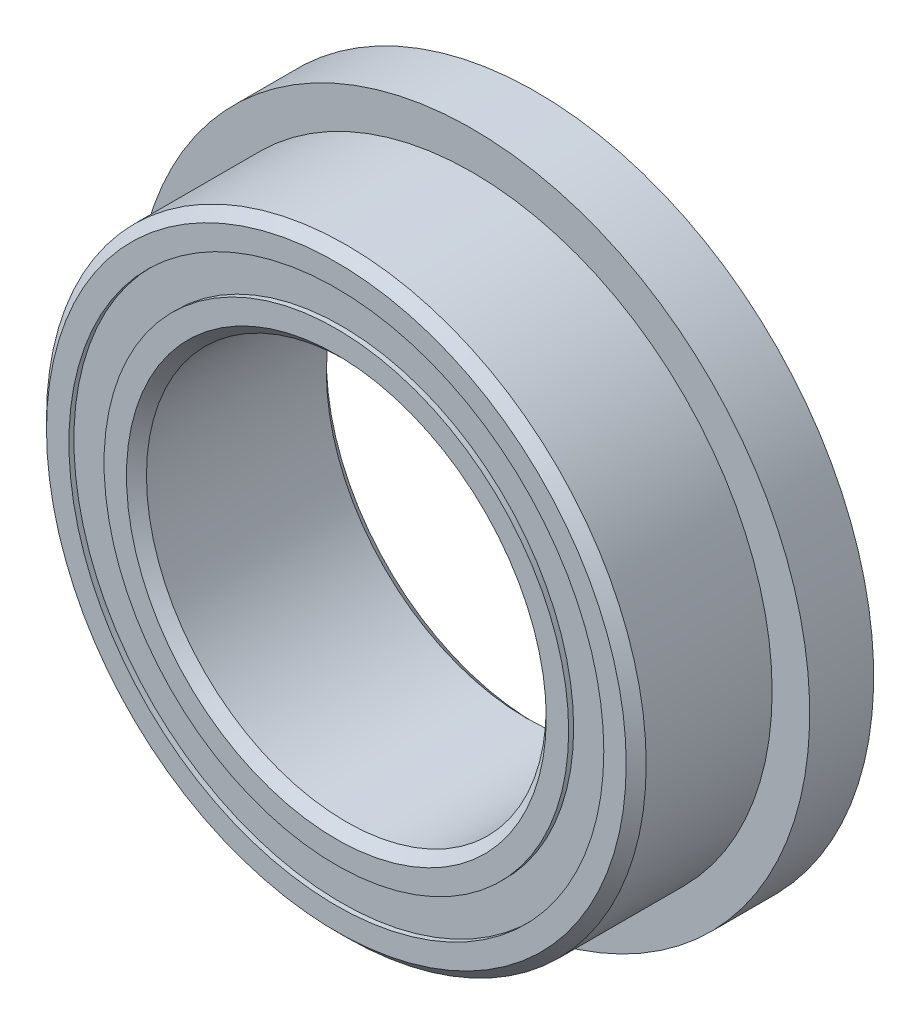
ISO-10303-21;
HEADER;
FILE_DESCRIPTION(('STEP AP214'),'2;1');
FILE_NAME('part.step','',(''),(''),'','','');
FILE_SCHEMA(('AUTOMOTIVE_DESIGN { 1 0 10303 214 1 1 1 1 }'));
ENDSEC;
DATA;
#1=APPLICATION_CONTEXT('core data for automotive mechanical design processes');
#2=APPLICATION_PROTOCOL_DEFINITION('international standard','automotive_design',2000,#1);
#3=PRODUCT_CONTEXT('',#1,'mechanical');
#4=PRODUCT('Part','Part','',(#3));
#5=PRODUCT_RELATED_PRODUCT_CATEGORY('part','',(#4));
#6=PRODUCT_DEFINITION_FORMATION('','',#4);
#7=PRODUCT_DEFINITION_CONTEXT('part definition',#1,'design');
#8=PRODUCT_DEFINITION('design','',#6,#7);
#9=PRODUCT_DEFINITION_SHAPE('','',#8);
#10=(LENGTH_UNIT() NAMED_UNIT(*) SI_UNIT(.MILLI.,.METRE.));
#11=(NAMED_UNIT(*) PLANE_ANGLE_UNIT() SI_UNIT($,.RADIAN.));
#12=(NAMED_UNIT(*) SI_UNIT($,.STERADIAN.) SOLID_ANGLE_UNIT());
#13=UNCERTAINTY_MEASURE_WITH_UNIT(LENGTH_MEASURE(1.E-05),#10,'distance_accuracy_value','');
#14=(GEOMETRIC_REPRESENTATION_CONTEXT(3) GLOBAL_UNCERTAINTY_ASSIGNED_CONTEXT((#13)) GLOBAL_UNIT_ASSIGNED_CONTEXT((#10,
#11,#12)) REPRESENTATION_CONTEXT('',''));
#15=CARTESIAN_POINT('',(0.,0.,0.));
#16=DIRECTION('',(0.,0.,1.));
#17=DIRECTION('',(1.,0.,0.));
#18=AXIS2_PLACEMENT_3D('',#15,#16,#17);
#19=CARTESIAN_POINT('',(0.,4.24787087912088,-1.508125));
#20=DIRECTION('',(0.,0.,1.));
#21=DIRECTION('',(1.,0.,0.));
#22=AXIS2_PLACEMENT_3D('',#19,#20,#21);
#23=PLANE('',#22);
#24=CARTESIAN_POINT('',(0.,0.,-1.508125));
#25=DIRECTION('',(0.,0.,1.));
#26=DIRECTION('',(1.,0.,0.));
#27=AXIS2_PLACEMENT_3D('',#24,#25,#26);
#28=CIRCLE('',#27,4.24787087912088);
#29=CARTESIAN_POINT('',(4.24787087912088,0.,-1.508125));
#30=VERTEX_POINT('',#29);
#31=EDGE_CURVE('E68',#30,#30,#28,.T.);
#32=ORIENTED_EDGE('',*,*,#31,.F.);
#33=EDGE_LOOP('',(#32));
#34=FACE_BOUND('',#33,.T.);
#35=CARTESIAN_POINT('',(0.,0.,-1.508125));
#36=DIRECTION('',(0.,0.,1.));
#37=DIRECTION('',(1.,0.,0.));
#38=AXIS2_PLACEMENT_3D('',#35,#36,#37);
#39=CIRCLE('',#38,3.68962912087912);
#40=CARTESIAN_POINT('',(3.68962912087912,0.,-1.508125));
#41=VERTEX_POINT('',#40);
#42=EDGE_CURVE('E11',#41,#41,#39,.T.);
#43=ORIENTED_EDGE('',*,*,#42,.T.);
#44=EDGE_LOOP('',(#43));
#45=FACE_BOUND('',#44,.T.);
#46=ADVANCED_FACE('F54',(#34,#45),#23,.F.);
#47=CARTESIAN_POINT('',(0.,0.,1.5875));
#48=DIRECTION('',(0.,0.,1.));
#49=DIRECTION('',(1.,0.,0.));
#50=AXIS2_PLACEMENT_3D('',#47,#48,#49);
#51=CYLINDRICAL_SURFACE('',#50,3.68962912087912);
#52=ORIENTED_EDGE('',*,*,#42,.F.);
#53=EDGE_LOOP('',(#52));
#54=FACE_BOUND('',#53,.T.);
#55=CARTESIAN_POINT('',(0.,0.,-0.758760243513405));
#56=DIRECTION('',(0.,0.,1.));
#57=DIRECTION('',(1.,0.,0.));
#58=AXIS2_PLACEMENT_3D('',#55,#56,#57);
#59=CIRCLE('',#58,3.68962912087912);
#60=CARTESIAN_POINT('',(3.68962912087912,0.,-0.758760243513405));
#61=VERTEX_POINT('',#60);
#62=EDGE_CURVE('E60',#61,#61,#59,.T.);
#63=ORIENTED_EDGE('',*,*,#62,.T.);
#64=EDGE_LOOP('',(#63));
#65=FACE_BOUND('',#64,.T.);
#66=ADVANCED_FACE('F77',(#54,#65),#51,.F.);
#67=CARTESIAN_POINT('',(0.,4.24787087912088,-0.758760243513405));
#68=DIRECTION('',(0.,0.,-1.));
#69=DIRECTION('',(-1.,0.,0.));
#70=AXIS2_PLACEMENT_3D('',#67,#68,#69);
#71=PLANE('',#70);
#72=ORIENTED_EDGE('',*,*,#62,.F.);
#73=EDGE_LOOP('',(#72));
#74=FACE_BOUND('',#73,.T.);
#75=CARTESIAN_POINT('',(0.,0.,-0.758760243513405));
#76=DIRECTION('',(0.,0.,1.));
#77=DIRECTION('',(1.,0.,0.));
#78=AXIS2_PLACEMENT_3D('',#75,#76,#77);
#79=CIRCLE('',#78,4.24787087912088);
#80=CARTESIAN_POINT('',(4.24787087912088,0.,-0.758760243513405));
#81=VERTEX_POINT('',#80);
#82=EDGE_CURVE('E64',#81,#81,#79,.T.);
#83=ORIENTED_EDGE('',*,*,#82,.T.);
#84=EDGE_LOOP('',(#83));
#85=FACE_BOUND('',#84,.T.);
#86=ADVANCED_FACE('F81',(#74,#85),#71,.F.);
#87=CARTESIAN_POINT('',(0.,0.,1.5875));
#88=DIRECTION('',(0.,0.,1.));
#89=DIRECTION('',(1.,0.,0.));
#90=AXIS2_PLACEMENT_3D('',#87,#88,#89);
#91=CYLINDRICAL_SURFACE('',#90,4.24787087912088);
#92=ORIENTED_EDGE('',*,*,#82,.F.);
#93=EDGE_LOOP('',(#92));
#94=FACE_BOUND('',#93,.T.);
#95=ORIENTED_EDGE('',*,*,#31,.T.);
#96=EDGE_LOOP('',(#95));
#97=FACE_BOUND('',#96,.T.);
#98=ADVANCED_FACE('F74',(#94,#97),#91,.T.);
#99=CLOSED_SHELL('',(#46,#66,#86,#98));
#100=MANIFOLD_SOLID_BREP('B2',#99);
#101=CARTESIAN_POINT('',(0.,4.24787087912088,1.508125));
#102=DIRECTION('',(0.,0.,-1.));
#103=DIRECTION('',(-1.,0.,0.));
#104=AXIS2_PLACEMENT_3D('',#101,#102,#103);
#105=PLANE('',#104);
#106=CARTESIAN_POINT('',(0.,0.,1.508125));
#107=DIRECTION('',(0.,0.,1.));
#108=DIRECTION('',(1.,0.,0.));
#109=AXIS2_PLACEMENT_3D('',#106,#107,#108);
#110=CIRCLE('',#109,3.68962912087912);
#111=CARTESIAN_POINT('',(3.68962912087912,0.,1.508125));
#112=VERTEX_POINT('',#111);
#113=EDGE_CURVE('E53',#112,#112,#110,.T.);
#114=ORIENTED_EDGE('',*,*,#113,.F.);
#115=EDGE_LOOP('',(#114));
#116=FACE_BOUND('',#115,.T.);
#117=CARTESIAN_POINT('',(0.,0.,1.508125));
#118=DIRECTION('',(0.,0.,1.));
#119=DIRECTION('',(1.,0.,0.));
#120=AXIS2_PLACEMENT_3D('',#117,#118,#119);
#121=CIRCLE('',#120,4.24787087912088);
#122=CARTESIAN_POINT('',(4.24787087912088,0.,1.508125));
#123=VERTEX_POINT('',#122);
#124=EDGE_CURVE('E136',#123,#123,#121,.T.);
#125=ORIENTED_EDGE('',*,*,#124,.T.);
#126=EDGE_LOOP('',(#125));
#127=FACE_BOUND('',#126,.T.);
#128=ADVANCED_FACE('F122',(#116,#127),#105,.F.);
#129=CARTESIAN_POINT('',(0.,0.,1.5875));
#130=DIRECTION('',(0.,0.,1.));
#131=DIRECTION('',(1.,0.,0.));
#132=AXIS2_PLACEMENT_3D('',#129,#130,#131);
#133=CYLINDRICAL_SURFACE('',#132,3.68962912087912);
#134=CARTESIAN_POINT('',(0.,0.,0.758760243513404));
#135=DIRECTION('',(0.,0.,1.));
#136=DIRECTION('',(1.,0.,0.));
#137=AXIS2_PLACEMENT_3D('',#134,#135,#136);
#138=CIRCLE('',#137,3.68962912087912);
#139=CARTESIAN_POINT('',(3.68962912087912,0.,0.758760243513404));
#140=VERTEX_POINT('',#139);
#141=EDGE_CURVE('E128',#140,#140,#138,.T.);
#142=ORIENTED_EDGE('',*,*,#141,.F.);
#143=EDGE_LOOP('',(#142));
#144=FACE_BOUND('',#143,.T.);
#145=ORIENTED_EDGE('',*,*,#113,.T.);
#146=EDGE_LOOP('',(#145));
#147=FACE_BOUND('',#146,.T.);
#148=ADVANCED_FACE('F151',(#144,#147),#133,.F.);
#149=CARTESIAN_POINT('',(0.,4.24787087912088,0.758760243513405));
#150=DIRECTION('',(0.,0.,1.));
#151=DIRECTION('',(1.,0.,0.));
#152=AXIS2_PLACEMENT_3D('',#149,#150,#151);
#153=PLANE('',#152);
#154=CARTESIAN_POINT('',(0.,0.,0.758760243513405));
#155=DIRECTION('',(0.,0.,1.));
#156=DIRECTION('',(1.,0.,0.));
#157=AXIS2_PLACEMENT_3D('',#154,#155,#156);
#158=CIRCLE('',#157,4.24787087912088);
#159=CARTESIAN_POINT('',(4.24787087912088,0.,0.758760243513405));
#160=VERTEX_POINT('',#159);
#161=EDGE_CURVE('E132',#160,#160,#158,.T.);
#162=ORIENTED_EDGE('',*,*,#161,.F.);
#163=EDGE_LOOP('',(#162));
#164=FACE_BOUND('',#163,.T.);
#165=ORIENTED_EDGE('',*,*,#141,.T.);
#166=EDGE_LOOP('',(#165));
#167=FACE_BOUND('',#166,.T.);
#168=ADVANCED_FACE('F146',(#164,#167),#153,.F.);
#169=CARTESIAN_POINT('',(0.,0.,1.5875));
#170=DIRECTION('',(0.,0.,1.));
#171=DIRECTION('',(1.,0.,0.));
#172=AXIS2_PLACEMENT_3D('',#169,#170,#171);
#173=CYLINDRICAL_SURFACE('',#172,4.24787087912088);
#174=ORIENTED_EDGE('',*,*,#124,.F.);
#175=EDGE_LOOP('',(#174));
#176=FACE_BOUND('',#175,.T.);
#177=ORIENTED_EDGE('',*,*,#161,.T.);
#178=EDGE_LOOP('',(#177));
#179=FACE_BOUND('',#178,.T.);
#180=ADVANCED_FACE('F143',(#176,#179),#173,.T.);
#181=CLOSED_SHELL('',(#128,#148,#168,#180));
#182=MANIFOLD_SOLID_BREP('B6',#181);
#183=CARTESIAN_POINT('',(-1.72197608962276,3.57572019448775,0.));
#184=DIRECTION('',(0.,0.,1.));
#185=DIRECTION('',(-0.433883739117546,0.900968867902425,0.));
#186=AXIS2_PLACEMENT_3D('',#183,#184,#185);
#187=SPHERICAL_SURFACE('',#186,0.758760243513405);
#188=CARTESIAN_POINT('',(-1.72197608962276,3.57572019448775,0.758760243513405));
#189=VERTEX_POINT('',#188);
#190=VERTEX_LOOP('',#189);
#191=FACE_BOUND('',#190,.T.);
#192=ADVANCED_FACE('F190',(#191),#187,.T.);
#193=CLOSED_SHELL('',(#192));
#194=MANIFOLD_SOLID_BREP('B48',#193);
#195=CARTESIAN_POINT('',(-3.10289369604496,2.47447515112689,0.));
#196=DIRECTION('',(0.,0.,1.));
#197=DIRECTION('',(-0.781831482468022,0.623489801858743,0.));
#198=AXIS2_PLACEMENT_3D('',#195,#196,#197);
#199=SPHERICAL_SURFACE('',#198,0.758760243513405);
#200=CARTESIAN_POINT('',(-3.10289369604496,2.47447515112689,0.758760243513405));
#201=VERTEX_POINT('',#200);
#202=VERTEX_LOOP('',#201);
#203=FACE_BOUND('',#202,.T.);
#204=ADVANCED_FACE('F215',(#203),#199,.T.);
#205=CLOSED_SHELL('',(#204));
#206=MANIFOLD_SOLID_BREP('B118',#205);
#207=CARTESIAN_POINT('',(-3.8692451514716,0.883129956639163,0.));
#208=DIRECTION('',(0.,0.,1.));
#209=DIRECTION('',(-0.974927912181821,0.222520933956325,0.));
#210=AXIS2_PLACEMENT_3D('',#207,#208,#209);
#211=SPHERICAL_SURFACE('',#210,0.758760243513405);
#212=CARTESIAN_POINT('',(-3.8692451514716,0.883129956639163,0.758760243513405));
#213=VERTEX_POINT('',#212);
#214=VERTEX_LOOP('',#213);
#215=FACE_BOUND('',#214,.T.);
#216=ADVANCED_FACE('F240',(#215),#211,.T.);
#217=CLOSED_SHELL('',(#216));
#218=MANIFOLD_SOLID_BREP('B186',#217);
#219=CARTESIAN_POINT('',(-3.86924515147162,-0.883129956639086,0.));
#220=DIRECTION('',(0.,0.,1.));
#221=DIRECTION('',(-0.974927912181826,-0.222520933956305,0.));
#222=AXIS2_PLACEMENT_3D('',#219,#220,#221);
#223=SPHERICAL_SURFACE('',#222,0.758760243513405);
#224=CARTESIAN_POINT('',(-3.86924515147162,-0.883129956639086,0.758760243513405));
#225=VERTEX_POINT('',#224);
#226=VERTEX_LOOP('',#225);
#227=FACE_BOUND('',#226,.T.);
#228=ADVANCED_FACE('F265',(#227),#223,.T.);
#229=CLOSED_SHELL('',(#228));
#230=MANIFOLD_SOLID_BREP('B211',#229);
#231=CARTESIAN_POINT('',(-3.10289369604501,-2.47447515112682,0.));
#232=DIRECTION('',(0.,0.,1.));
#233=DIRECTION('',(-0.781831482468035,-0.623489801858727,0.));
#234=AXIS2_PLACEMENT_3D('',#231,#232,#233);
#235=SPHERICAL_SURFACE('',#234,0.758760243513405);
#236=CARTESIAN_POINT('',(-3.10289369604501,-2.47447515112682,0.758760243513405));
#237=VERTEX_POINT('',#236);
#238=VERTEX_LOOP('',#237);
#239=FACE_BOUND('',#238,.T.);
#240=ADVANCED_FACE('F290',(#239),#235,.T.);
#241=CLOSED_SHELL('',(#240));
#242=MANIFOLD_SOLID_BREP('B236',#241);
#243=CARTESIAN_POINT('',(-1.72197608962284,-3.57572019448771,0.));
#244=DIRECTION('',(0.,0.,1.));
#245=DIRECTION('',(-0.433883739117565,-0.900968867902416,0.));
#246=AXIS2_PLACEMENT_3D('',#243,#244,#245);
#247=SPHERICAL_SURFACE('',#246,0.758760243513405);
#248=CARTESIAN_POINT('',(-1.72197608962284,-3.57572019448771,0.758760243513405));
#249=VERTEX_POINT('',#248);
#250=VERTEX_LOOP('',#249);
#251=FACE_BOUND('',#250,.T.);
#252=ADVANCED_FACE('F315',(#251),#247,.T.);
#253=CLOSED_SHELL('',(#252));
#254=MANIFOLD_SOLID_BREP('B261',#253);
#255=CARTESIAN_POINT('',(0.,-3.96875,0.));
#256=DIRECTION('',(0.,0.,1.));
#257=DIRECTION('',(0.,-1.,0.));
#258=AXIS2_PLACEMENT_3D('',#255,#256,#257);
#259=SPHERICAL_SURFACE('',#258,0.758760243513405);
#260=CARTESIAN_POINT('',(0.,-3.96875,0.758760243513405));
#261=VERTEX_POINT('',#260);
#262=VERTEX_LOOP('',#261);
#263=FACE_BOUND('',#262,.T.);
#264=ADVANCED_FACE('F340',(#263),#259,.T.);
#265=CLOSED_SHELL('',(#264));
#266=MANIFOLD_SOLID_BREP('B286',#265);
#267=CARTESIAN_POINT('',(1.72197608962279,-3.57572019448774,0.));
#268=DIRECTION('',(0.,0.,1.));
#269=DIRECTION('',(0.433883739117553,-0.900968867902422,0.));
#270=AXIS2_PLACEMENT_3D('',#267,#268,#269);
#271=SPHERICAL_SURFACE('',#270,0.758760243513405);
#272=CARTESIAN_POINT('',(1.72197608962279,-3.57572019448774,0.758760243513405));
#273=VERTEX_POINT('',#272);
#274=VERTEX_LOOP('',#273);
#275=FACE_BOUND('',#274,.T.);
#276=ADVANCED_FACE('F365',(#275),#271,.T.);
#277=CLOSED_SHELL('',(#276));
#278=MANIFOLD_SOLID_BREP('B311',#277);
#279=CARTESIAN_POINT('',(3.10289369604498,-2.47447515112686,0.));
#280=DIRECTION('',(0.,0.,1.));
#281=DIRECTION('',(0.781831482468027,-0.623489801858737,0.));
#282=AXIS2_PLACEMENT_3D('',#279,#280,#281);
#283=SPHERICAL_SURFACE('',#282,0.758760243513405);
#284=CARTESIAN_POINT('',(3.10289369604498,-2.47447515112686,0.758760243513405));
#285=VERTEX_POINT('',#284);
#286=VERTEX_LOOP('',#285);
#287=FACE_BOUND('',#286,.T.);
#288=ADVANCED_FACE('F390',(#287),#283,.T.);
#289=CLOSED_SHELL('',(#288));
#290=MANIFOLD_SOLID_BREP('B336',#289);
#291=CARTESIAN_POINT('',(3.86924515147161,-0.883129956639138,0.));
#292=DIRECTION('',(0.,0.,1.));
#293=DIRECTION('',(0.974927912181823,-0.222520933956318,0.));
#294=AXIS2_PLACEMENT_3D('',#291,#292,#293);
#295=SPHERICAL_SURFACE('',#294,0.758760243513405);
#296=CARTESIAN_POINT('',(3.86924515147161,-0.883129956639138,0.758760243513405));
#297=VERTEX_POINT('',#296);
#298=VERTEX_LOOP('',#297);
#299=FACE_BOUND('',#298,.T.);
#300=ADVANCED_FACE('F415',(#299),#295,.T.);
#301=CLOSED_SHELL('',(#300));
#302=MANIFOLD_SOLID_BREP('B361',#301);
#303=CARTESIAN_POINT('',(3.86924515147162,0.883129956639111,0.));
#304=DIRECTION('',(0.,0.,1.));
#305=DIRECTION('',(0.974927912181824,0.222520933956311,0.));
#306=AXIS2_PLACEMENT_3D('',#303,#304,#305);
#307=SPHERICAL_SURFACE('',#306,0.758760243513405);
#308=CARTESIAN_POINT('',(3.86924515147162,0.883129956639111,0.758760243513405));
#309=VERTEX_POINT('',#308);
#310=VERTEX_LOOP('',#309);
#311=FACE_BOUND('',#310,.T.);
#312=ADVANCED_FACE('F440',(#311),#307,.T.);
#313=CLOSED_SHELL('',(#312));
#314=MANIFOLD_SOLID_BREP('B386',#313);
#315=CARTESIAN_POINT('',(3.102893696045,2.47447515112684,0.));
#316=DIRECTION('',(0.,0.,1.));
#317=DIRECTION('',(0.781831482468031,0.623489801858732,0.));
#318=AXIS2_PLACEMENT_3D('',#315,#316,#317);
#319=SPHERICAL_SURFACE('',#318,0.758760243513405);
#320=CARTESIAN_POINT('',(3.102893696045,2.47447515112684,0.758760243513405));
#321=VERTEX_POINT('',#320);
#322=VERTEX_LOOP('',#321);
#323=FACE_BOUND('',#322,.T.);
#324=ADVANCED_FACE('F465',(#323),#319,.T.);
#325=CLOSED_SHELL('',(#324));
#326=MANIFOLD_SOLID_BREP('B411',#325);
#327=CARTESIAN_POINT('',(1.72197608962281,3.57572019448772,0.));
#328=DIRECTION('',(0.,0.,1.));
#329=DIRECTION('',(0.433883739117559,0.900968867902419,0.));
#330=AXIS2_PLACEMENT_3D('',#327,#328,#329);
#331=SPHERICAL_SURFACE('',#330,0.758760243513405);
#332=CARTESIAN_POINT('',(1.72197608962281,3.57572019448772,0.758760243513405));
#333=VERTEX_POINT('',#332);
#334=VERTEX_LOOP('',#333);
#335=FACE_BOUND('',#334,.T.);
#336=ADVANCED_FACE('F490',(#335),#331,.T.);
#337=CLOSED_SHELL('',(#336));
#338=MANIFOLD_SOLID_BREP('B436',#337);
#339=CARTESIAN_POINT('',(0.,3.96875,0.));
#340=DIRECTION('',(0.,0.,1.));
#341=DIRECTION('',(0.,1.,0.));
#342=AXIS2_PLACEMENT_3D('',#339,#340,#341);
#343=SPHERICAL_SURFACE('',#342,0.758760243513405);
#344=CARTESIAN_POINT('',(0.,3.96875,0.758760243513405));
#345=VERTEX_POINT('',#344);
#346=VERTEX_LOOP('',#345);
#347=FACE_BOUND('',#346,.T.);
#348=ADVANCED_FACE('F517',(#347),#343,.T.);
#349=CLOSED_SHELL('',(#348));
#350=MANIFOLD_SOLID_BREP('B461',#349);
#351=CARTESIAN_POINT('',(0.,3.68962912087912,1.5875));
#352=DIRECTION('',(0.,0.,-1.));
#353=DIRECTION('',(-1.,0.,0.));
#354=AXIS2_PLACEMENT_3D('',#351,#352,#353);
#355=PLANE('',#354);
#356=CARTESIAN_POINT('',(0.,0.,1.5875));
#357=DIRECTION('',(0.,0.,1.));
#358=DIRECTION('',(1.,0.,0.));
#359=AXIS2_PLACEMENT_3D('',#356,#357,#358);
#360=CIRCLE('',#359,3.33375);
#361=CARTESIAN_POINT('',(3.33375,0.,1.5875));
#362=VERTEX_POINT('',#361);
#363=EDGE_CURVE('E565',#362,#362,#360,.T.);
#364=ORIENTED_EDGE('',*,*,#363,.F.);
#365=EDGE_LOOP('',(#364));
#366=FACE_BOUND('',#365,.T.);
#367=CARTESIAN_POINT('',(0.,0.,1.5875));
#368=DIRECTION('',(0.,0.,1.));
#369=DIRECTION('',(1.,0.,0.));
#370=AXIS2_PLACEMENT_3D('',#367,#368,#369);
#371=CIRCLE('',#370,3.68962912087912);
#372=CARTESIAN_POINT('',(3.68962912087912,0.,1.5875));
#373=VERTEX_POINT('',#372);
#374=EDGE_CURVE('E516',#373,#373,#371,.T.);
#375=ORIENTED_EDGE('',*,*,#374,.T.);
#376=EDGE_LOOP('',(#375));
#377=FACE_BOUND('',#376,.T.);
#378=ADVANCED_FACE('F537',(#366,#377),#355,.F.);
#379=CARTESIAN_POINT('',(0.,0.,1.5875));
#380=DIRECTION('',(0.,0.,1.));
#381=DIRECTION('',(1.,0.,0.));
#382=AXIS2_PLACEMENT_3D('',#379,#380,#381);
#383=CYLINDRICAL_SURFACE('',#382,3.68962912087912);
#384=ORIENTED_EDGE('',*,*,#374,.F.);
#385=EDGE_LOOP('',(#384));
#386=FACE_BOUND('',#385,.T.);
#387=CARTESIAN_POINT('',(0.,0.,0.705555555555555));
#388=DIRECTION('',(0.,0.,1.));
#389=DIRECTION('',(1.,0.,0.));
#390=AXIS2_PLACEMENT_3D('',#387,#388,#389);
#391=CIRCLE('',#390,3.68962912087912);
#392=CARTESIAN_POINT('',(3.68962912087912,0.,0.705555555555555));
#393=VERTEX_POINT('',#392);
#394=EDGE_CURVE('E543',#393,#393,#391,.T.);
#395=ORIENTED_EDGE('',*,*,#394,.T.);
#396=EDGE_LOOP('',(#395));
#397=FACE_BOUND('',#396,.T.);
#398=ADVANCED_FACE('F572',(#386,#397),#383,.T.);
#399=CARTESIAN_POINT('',(0.,0.,0.));
#400=DIRECTION('',(0.,0.,1.));
#401=DIRECTION('',(1.,0.,0.));
#402=AXIS2_PLACEMENT_3D('',#399,#400,#401);
#403=TOROIDAL_SURFACE('',#402,3.96875,0.758760243513404);
#404=ORIENTED_EDGE('',*,*,#394,.F.);
#405=EDGE_LOOP('',(#404));
#406=FACE_BOUND('',#405,.T.);
#407=CARTESIAN_POINT('',(0.,0.,-0.705555555555556));
#408=DIRECTION('',(0.,0.,1.));
#409=DIRECTION('',(1.,0.,0.));
#410=AXIS2_PLACEMENT_3D('',#407,#408,#409);
#411=CIRCLE('',#410,3.68962912087912);
#412=CARTESIAN_POINT('',(3.68962912087912,0.,-0.705555555555556));
#413=VERTEX_POINT('',#412);
#414=EDGE_CURVE('E547',#413,#413,#411,.T.);
#415=ORIENTED_EDGE('',*,*,#414,.T.);
#416=EDGE_LOOP('',(#415));
#417=FACE_BOUND('',#416,.T.);
#418=ADVANCED_FACE('F576',(#406,#417),#403,.F.);
#419=CARTESIAN_POINT('',(0.,0.,1.5875));
#420=DIRECTION('',(0.,0.,1.));
#421=DIRECTION('',(1.,0.,0.));
#422=AXIS2_PLACEMENT_3D('',#419,#420,#421);
#423=CYLINDRICAL_SURFACE('',#422,3.68962912087912);
#424=ORIENTED_EDGE('',*,*,#414,.F.);
#425=EDGE_LOOP('',(#424));
#426=FACE_BOUND('',#425,.T.);
#427=CARTESIAN_POINT('',(0.,0.,-1.5875));
#428=DIRECTION('',(0.,0.,1.));
#429=DIRECTION('',(1.,0.,0.));
#430=AXIS2_PLACEMENT_3D('',#427,#428,#429);
#431=CIRCLE('',#430,3.68962912087912);
#432=CARTESIAN_POINT('',(3.68962912087912,0.,-1.5875));
#433=VERTEX_POINT('',#432);
#434=EDGE_CURVE('E551',#433,#433,#431,.T.);
#435=ORIENTED_EDGE('',*,*,#434,.T.);
#436=EDGE_LOOP('',(#435));
#437=FACE_BOUND('',#436,.T.);
#438=ADVANCED_FACE('F581',(#426,#437),#423,.T.);
#439=CARTESIAN_POINT('',(0.,3.33375,-1.5875));
#440=DIRECTION('',(0.,0.,1.));
#441=DIRECTION('',(1.,0.,0.));
#442=AXIS2_PLACEMENT_3D('',#439,#440,#441);
#443=PLANE('',#442);
#444=ORIENTED_EDGE('',*,*,#434,.F.);
#445=EDGE_LOOP('',(#444));
#446=FACE_BOUND('',#445,.T.);
#447=CARTESIAN_POINT('',(0.,0.,-1.5875));
#448=DIRECTION('',(0.,0.,1.));
#449=DIRECTION('',(1.,0.,0.));
#450=AXIS2_PLACEMENT_3D('',#447,#448,#449);
#451=CIRCLE('',#450,3.33375);
#452=CARTESIAN_POINT('',(3.33375,0.,-1.5875));
#453=VERTEX_POINT('',#452);
#454=EDGE_CURVE('E556',#453,#453,#451,.T.);
#455=ORIENTED_EDGE('',*,*,#454,.T.);
#456=EDGE_LOOP('',(#455));
#457=FACE_BOUND('',#456,.T.);
#458=ADVANCED_FACE('F587',(#446,#457),#443,.F.);
#459=CARTESIAN_POINT('',(0.,0.,-1.42875));
#460=DIRECTION('',(0.,0.,-1.));
#461=DIRECTION('',(-1.,0.,0.));
#462=AXIS2_PLACEMENT_3D('',#459,#460,#461);
#463=CONICAL_SURFACE('',#462,3.175,0.785398163397446);
#464=ORIENTED_EDGE('',*,*,#454,.F.);
#465=EDGE_LOOP('',(#464));
#466=FACE_BOUND('',#465,.T.);
#467=CARTESIAN_POINT('',(0.,0.,-1.42875));
#468=DIRECTION('',(0.,0.,1.));
#469=DIRECTION('',(1.,0.,0.));
#470=AXIS2_PLACEMENT_3D('',#467,#468,#469);
#471=CIRCLE('',#470,3.175);
#472=CARTESIAN_POINT('',(3.175,0.,-1.42875));
#473=VERTEX_POINT('',#472);
#474=EDGE_CURVE('E559',#473,#473,#471,.T.);
#475=ORIENTED_EDGE('',*,*,#474,.T.);
#476=EDGE_LOOP('',(#475));
#477=FACE_BOUND('',#476,.T.);
#478=ADVANCED_FACE('F591',(#466,#477),#463,.F.);
#479=CARTESIAN_POINT('',(0.,0.,1.5875));
#480=DIRECTION('',(0.,0.,1.));
#481=DIRECTION('',(1.,0.,0.));
#482=AXIS2_PLACEMENT_3D('',#479,#480,#481);
#483=CYLINDRICAL_SURFACE('',#482,3.175);
#484=ORIENTED_EDGE('',*,*,#474,.F.);
#485=EDGE_LOOP('',(#484));
#486=FACE_BOUND('',#485,.T.);
#487=CARTESIAN_POINT('',(0.,0.,1.42875));
#488=DIRECTION('',(0.,0.,1.));
#489=DIRECTION('',(1.,0.,0.));
#490=AXIS2_PLACEMENT_3D('',#487,#488,#489);
#491=CIRCLE('',#490,3.175);
#492=CARTESIAN_POINT('',(3.175,0.,1.42875));
#493=VERTEX_POINT('',#492);
#494=EDGE_CURVE('E562',#493,#493,#491,.T.);
#495=ORIENTED_EDGE('',*,*,#494,.T.);
#496=EDGE_LOOP('',(#495));
#497=FACE_BOUND('',#496,.T.);
#498=ADVANCED_FACE('F595',(#486,#497),#483,.F.);
#499=CARTESIAN_POINT('',(0.,0.,1.5875));
#500=DIRECTION('',(0.,0.,1.));
#501=DIRECTION('',(1.,0.,0.));
#502=AXIS2_PLACEMENT_3D('',#499,#500,#501);
#503=CONICAL_SURFACE('',#502,3.33375,0.785398163397451);
#504=ORIENTED_EDGE('',*,*,#494,.F.);
#505=EDGE_LOOP('',(#504));
#506=FACE_BOUND('',#505,.T.);
#507=ORIENTED_EDGE('',*,*,#363,.T.);
#508=EDGE_LOOP('',(#507));
#509=FACE_BOUND('',#508,.T.);
#510=ADVANCED_FACE('F569',(#506,#509),#503,.F.);
#511=CLOSED_SHELL('',(#378,#398,#418,#438,#458,#478,#498,#510));
#512=MANIFOLD_SOLID_BREP('B486',#511);
#513=CARTESIAN_POINT('',(0.,0.,1.42875));
#514=DIRECTION('',(0.,0.,-1.));
#515=DIRECTION('',(-1.,0.,0.));
#516=AXIS2_PLACEMENT_3D('',#513,#514,#515);
#517=CONICAL_SURFACE('',#516,4.7625,0.785398163397446);
#518=CARTESIAN_POINT('',(0.,0.,1.5875));
#519=DIRECTION('',(0.,0.,1.));
#520=DIRECTION('',(1.,0.,0.));
#521=AXIS2_PLACEMENT_3D('',#518,#519,#520);
#522=CIRCLE('',#521,4.60375);
#523=CARTESIAN_POINT('',(4.60375,0.,1.5875));
#524=VERTEX_POINT('',#523);
#525=EDGE_CURVE('E678',#524,#524,#522,.T.);
#526=ORIENTED_EDGE('',*,*,#525,.F.);
#527=EDGE_LOOP('',(#526));
#528=FACE_BOUND('',#527,.T.);
#529=CARTESIAN_POINT('',(0.,0.,1.42875));
#530=DIRECTION('',(0.,0.,1.));
#531=DIRECTION('',(1.,0.,0.));
#532=AXIS2_PLACEMENT_3D('',#529,#530,#531);
#533=CIRCLE('',#532,4.7625);
#534=CARTESIAN_POINT('',(4.7625,0.,1.42875));
#535=VERTEX_POINT('',#534);
#536=EDGE_CURVE('E536',#535,#535,#533,.T.);
#537=ORIENTED_EDGE('',*,*,#536,.T.);
#538=EDGE_LOOP('',(#537));
#539=FACE_BOUND('',#538,.T.);
#540=ADVANCED_FACE('F659',(#528,#539),#517,.T.);
#541=CARTESIAN_POINT('',(0.,0.,1.5875));
#542=DIRECTION('',(0.,0.,1.));
#543=DIRECTION('',(1.,0.,0.));
#544=AXIS2_PLACEMENT_3D('',#541,#542,#543);
#545=CYLINDRICAL_SURFACE('',#544,4.7625);
#546=CARTESIAN_POINT('',(0.,0.,-0.571499999999999));
#547=DIRECTION('',(0.,0.,1.));
#548=DIRECTION('',(1.,0.,0.));
#549=AXIS2_PLACEMENT_3D('',#546,#547,#548);
#550=CIRCLE('',#549,4.7625);
#551=CARTESIAN_POINT('',(4.7625,0.,-0.571499999999999));
#552=VERTEX_POINT('',#551);
#553=EDGE_CURVE('E681',#552,#552,#550,.T.);
#554=ORIENTED_EDGE('',*,*,#553,.T.);
#555=EDGE_LOOP('',(#554));
#556=FACE_BOUND('',#555,.T.);
#557=ORIENTED_EDGE('',*,*,#536,.F.);
#558=EDGE_LOOP('',(#557));
#559=FACE_BOUND('',#558,.T.);
#560=ADVANCED_FACE('F715',(#556,#559),#545,.T.);
#561=CARTESIAN_POINT('',(0.,0.,0.));
#562=DIRECTION('',(0.,0.,1.));
#563=DIRECTION('',(1.,0.,0.));
#564=AXIS2_PLACEMENT_3D('',#561,#562,#563);
#565=TOROIDAL_SURFACE('',#564,3.96875,0.758760243513405);
#566=CARTESIAN_POINT('',(0.,0.,-0.571499999999999));
#567=DIRECTION('',(0.,0.,1.));
#568=DIRECTION('',(1.,0.,0.));
#569=AXIS2_PLACEMENT_3D('',#566,#567,#568);
#570=CIRCLE('',#569,4.46785405441804);
#571=CARTESIAN_POINT('',(4.46785405441804,0.,-0.571499999999999));
#572=VERTEX_POINT('',#571);
#573=EDGE_CURVE('E662',#572,#572,#570,.F.);
#574=ORIENTED_EDGE('',*,*,#573,.T.);
#575=EDGE_LOOP('',(#574));
#576=FACE_BOUND('',#575,.T.);
#577=CARTESIAN_POINT('',(0.,0.,0.705555555555555));
#578=DIRECTION('',(0.,0.,1.));
#579=DIRECTION('',(1.,0.,0.));
#580=AXIS2_PLACEMENT_3D('',#577,#578,#579);
#581=CIRCLE('',#580,4.24787087912088);
#582=CARTESIAN_POINT('',(4.24787087912088,0.,0.705555555555555));
#583=VERTEX_POINT('',#582);
#584=EDGE_CURVE('E670',#583,#583,#581,.T.);
#585=ORIENTED_EDGE('',*,*,#584,.T.);
#586=EDGE_LOOP('',(#585));
#587=FACE_BOUND('',#586,.T.);
#588=ADVANCED_FACE('F721',(#576,#587),#565,.F.);
#589=CARTESIAN_POINT('',(0.,0.,1.5875));
#590=DIRECTION('',(0.,0.,1.));
#591=DIRECTION('',(1.,0.,0.));
#592=AXIS2_PLACEMENT_3D('',#589,#590,#591);
#593=CYLINDRICAL_SURFACE('',#592,4.24787087912088);
#594=ORIENTED_EDGE('',*,*,#584,.F.);
#595=EDGE_LOOP('',(#594));
#596=FACE_BOUND('',#595,.T.);
#597=CARTESIAN_POINT('',(0.,0.,1.5875));
#598=DIRECTION('',(0.,0.,1.));
#599=DIRECTION('',(1.,0.,0.));
#600=AXIS2_PLACEMENT_3D('',#597,#598,#599);
#601=CIRCLE('',#600,4.24787087912088);
#602=CARTESIAN_POINT('',(4.24787087912088,0.,1.5875));
#603=VERTEX_POINT('',#602);
#604=EDGE_CURVE('E675',#603,#603,#601,.T.);
#605=ORIENTED_EDGE('',*,*,#604,.T.);
#606=EDGE_LOOP('',(#605));
#607=FACE_BOUND('',#606,.T.);
#608=ADVANCED_FACE('F727',(#596,#607),#593,.F.);
#609=CARTESIAN_POINT('',(0.,4.60375,1.5875));
#610=DIRECTION('',(0.,0.,-1.));
#611=DIRECTION('',(-1.,0.,0.));
#612=AXIS2_PLACEMENT_3D('',#609,#610,#611);
#613=PLANE('',#612);
#614=ORIENTED_EDGE('',*,*,#604,.F.);
#615=EDGE_LOOP('',(#614));
#616=FACE_BOUND('',#615,.T.);
#617=ORIENTED_EDGE('',*,*,#525,.T.);
#618=EDGE_LOOP('',(#617));
#619=FACE_BOUND('',#618,.T.);
#620=ADVANCED_FACE('F725',(#616,#619),#613,.F.);
#621=CARTESIAN_POINT('',(0.,4.24787087912088,-0.571499999999999));
#622=DIRECTION('',(0.,0.,1.));
#623=DIRECTION('',(1.,0.,0.));
#624=AXIS2_PLACEMENT_3D('',#621,#622,#623);
#625=PLANE('',#624);
#626=CARTESIAN_POINT('',(0.,0.,-0.571499999999999));
#627=DIRECTION('',(0.,0.,-1.));
#628=DIRECTION('',(-1.,0.,0.));
#629=AXIS2_PLACEMENT_3D('',#626,#627,#628);
#630=CIRCLE('',#629,4.24787087912088);
#631=CARTESIAN_POINT('',(-4.24787087912088,0.,-0.571499999999999));
#632=VERTEX_POINT('',#631);
#633=EDGE_CURVE('E690',#632,#632,#630,.T.);
#634=ORIENTED_EDGE('',*,*,#633,.T.);
#635=EDGE_LOOP('',(#634));
#636=FACE_BOUND('',#635,.T.);
#637=ORIENTED_EDGE('',*,*,#573,.F.);
#638=EDGE_LOOP('',(#637));
#639=FACE_BOUND('',#638,.T.);
#640=ADVANCED_FACE('F694',(#636,#639),#625,.T.);
#641=CARTESIAN_POINT('',(0.,0.,-0.571499999999999));
#642=DIRECTION('',(0.,0.,-1.));
#643=DIRECTION('',(-1.,0.,0.));
#644=AXIS2_PLACEMENT_3D('',#641,#642,#643);
#645=CIRCLE('',#644,5.3594);
#646=CARTESIAN_POINT('',(-5.3594,0.,-0.571499999999999));
#647=VERTEX_POINT('',#646);
#648=EDGE_CURVE('E687',#647,#647,#645,.T.);
#649=ORIENTED_EDGE('',*,*,#648,.F.);
#650=EDGE_LOOP('',(#649));
#651=FACE_BOUND('',#650,.T.);
#652=ORIENTED_EDGE('',*,*,#553,.F.);
#653=EDGE_LOOP('',(#652));
#654=FACE_BOUND('',#653,.T.);
#655=ADVANCED_FACE('F709',(#651,#654),#625,.T.);
#656=CARTESIAN_POINT('',(0.,0.,-1.5875));
#657=DIRECTION('',(0.,0.,-1.));
#658=DIRECTION('',(-1.,0.,0.));
#659=AXIS2_PLACEMENT_3D('',#656,#657,#658);
#660=CYLINDRICAL_SURFACE('',#659,5.3594);
#661=ORIENTED_EDGE('',*,*,#648,.T.);
#662=EDGE_LOOP('',(#661));
#663=FACE_BOUND('',#662,.T.);
#664=CARTESIAN_POINT('',(0.,0.,-1.5875));
#665=DIRECTION('',(0.,0.,-1.));
#666=DIRECTION('',(-1.,0.,0.));
#667=AXIS2_PLACEMENT_3D('',#664,#665,#666);
#668=CIRCLE('',#667,5.3594);
#669=CARTESIAN_POINT('',(-5.3594,0.,-1.5875));
#670=VERTEX_POINT('',#669);
#671=EDGE_CURVE('E684',#670,#670,#668,.T.);
#672=ORIENTED_EDGE('',*,*,#671,.F.);
#673=EDGE_LOOP('',(#672));
#674=FACE_BOUND('',#673,.T.);
#675=ADVANCED_FACE('F700',(#663,#674),#660,.T.);
#676=CARTESIAN_POINT('',(0.,0.,1.5875));
#677=DIRECTION('',(0.,0.,1.));
#678=DIRECTION('',(1.,0.,0.));
#679=AXIS2_PLACEMENT_3D('',#676,#677,#678);
#680=CYLINDRICAL_SURFACE('',#679,4.24787087912088);
#681=CARTESIAN_POINT('',(0.,0.,-1.5875));
#682=DIRECTION('',(0.,0.,1.));
#683=DIRECTION('',(1.,0.,0.));
#684=AXIS2_PLACEMENT_3D('',#681,#682,#683);
#685=CIRCLE('',#684,4.24787087912088);
#686=CARTESIAN_POINT('',(4.24787087912088,0.,-1.5875));
#687=VERTEX_POINT('',#686);
#688=EDGE_CURVE('E666',#687,#687,#685,.T.);
#689=ORIENTED_EDGE('',*,*,#688,.F.);
#690=EDGE_LOOP('',(#689));
#691=FACE_BOUND('',#690,.T.);
#692=ORIENTED_EDGE('',*,*,#633,.F.);
#693=EDGE_LOOP('',(#692));
#694=FACE_BOUND('',#693,.T.);
#695=ADVANCED_FACE('F697',(#691,#694),#680,.F.);
#696=CARTESIAN_POINT('',(0.,4.60375,-1.5875));
#697=DIRECTION('',(0.,0.,1.));
#698=DIRECTION('',(1.,0.,0.));
#699=AXIS2_PLACEMENT_3D('',#696,#697,#698);
#700=PLANE('',#699);
#701=ORIENTED_EDGE('',*,*,#688,.T.);
#702=EDGE_LOOP('',(#701));
#703=FACE_BOUND('',#702,.T.);
#704=ORIENTED_EDGE('',*,*,#671,.T.);
#705=EDGE_LOOP('',(#704));
#706=FACE_BOUND('',#705,.T.);
#707=ADVANCED_FACE('F699',(#703,#706),#700,.F.);
#708=CLOSED_SHELL('',(#540,#560,#588,#608,#620,#640,#655,#675,#695,#707));
#709=MANIFOLD_SOLID_BREP('B511',#708);
#710=ADVANCED_BREP_SHAPE_REPRESENTATION('',(#18,#100,#182,#194,#206,#218,#230,#242,#254,#266,
#278,#290,#302,#314,#326,#338,#350,#512,#709),#14);
#711=SHAPE_DEFINITION_REPRESENTATION(#9,#710);
ENDSEC;
END-ISO-10303-21;
